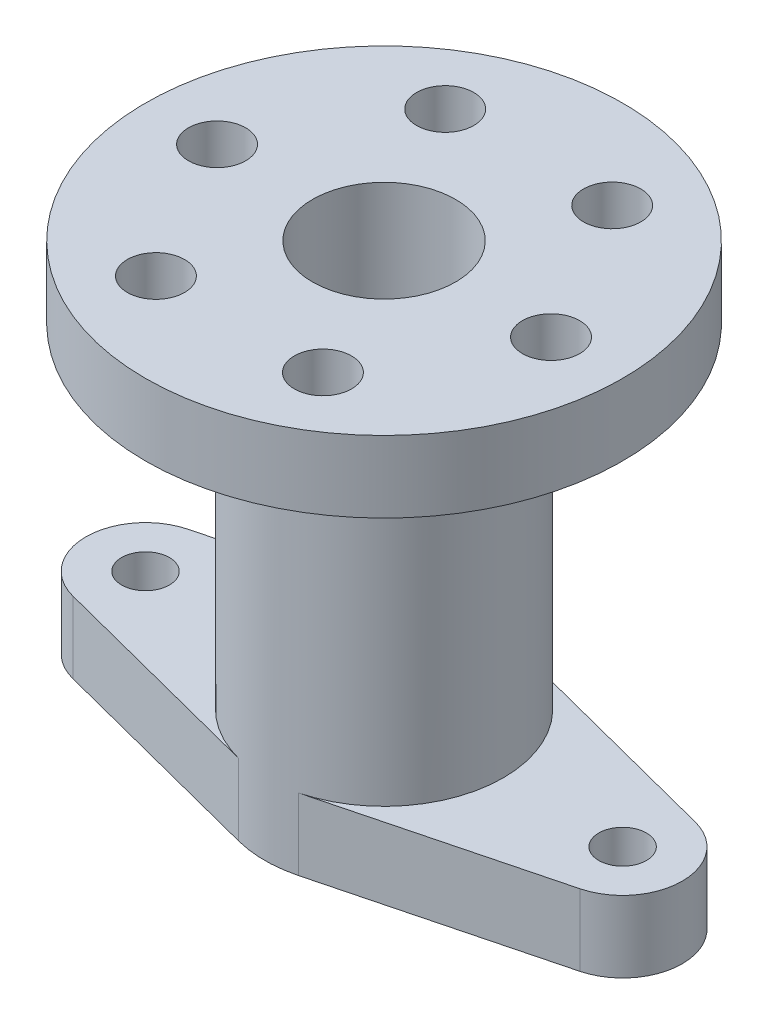
ISO-10303-21;
HEADER;
FILE_DESCRIPTION(('STEP AP214'),'2;1');
FILE_NAME('part.step','',(''),(''),'','','');
FILE_SCHEMA(('AUTOMOTIVE_DESIGN { 1 0 10303 214 1 1 1 1 }'));
ENDSEC;
DATA;
#1=APPLICATION_CONTEXT('core data for automotive mechanical design processes');
#2=APPLICATION_PROTOCOL_DEFINITION('international standard','automotive_design',2000,#1);
#3=PRODUCT_CONTEXT('',#1,'mechanical');
#4=PRODUCT('Part','Part','',(#3));
#5=PRODUCT_RELATED_PRODUCT_CATEGORY('part','',(#4));
#6=PRODUCT_DEFINITION_FORMATION('','',#4);
#7=PRODUCT_DEFINITION_CONTEXT('part definition',#1,'design');
#8=PRODUCT_DEFINITION('design','',#6,#7);
#9=PRODUCT_DEFINITION_SHAPE('','',#8);
#10=(LENGTH_UNIT() NAMED_UNIT(*) SI_UNIT(.MILLI.,.METRE.));
#11=(NAMED_UNIT(*) PLANE_ANGLE_UNIT() SI_UNIT($,.RADIAN.));
#12=(NAMED_UNIT(*) SI_UNIT($,.STERADIAN.) SOLID_ANGLE_UNIT());
#13=UNCERTAINTY_MEASURE_WITH_UNIT(LENGTH_MEASURE(1.E-05),#10,'distance_accuracy_value','');
#14=(GEOMETRIC_REPRESENTATION_CONTEXT(3) GLOBAL_UNCERTAINTY_ASSIGNED_CONTEXT((#13)) GLOBAL_UNIT_ASSIGNED_CONTEXT((#10,
#11,#12)) REPRESENTATION_CONTEXT('',''));
#15=CARTESIAN_POINT('',(0.,0.,0.));
#16=DIRECTION('',(0.,0.,1.));
#17=DIRECTION('',(1.,0.,0.));
#18=AXIS2_PLACEMENT_3D('',#15,#16,#17);
#19=CARTESIAN_POINT('',(-50.,0.,0.));
#20=DIRECTION('',(0.,1.,0.));
#21=DIRECTION('',(0.,0.,1.));
#22=AXIS2_PLACEMENT_3D('',#19,#20,#21);
#23=PLANE('',#22);
#24=CARTESIAN_POINT('',(0.,0.,0.));
#25=DIRECTION('',(0.,1.,0.));
#26=DIRECTION('',(0.,0.,1.));
#27=AXIS2_PLACEMENT_3D('',#24,#25,#26);
#28=CIRCLE('',#27,15.);
#29=CARTESIAN_POINT('',(0.,0.,15.));
#30=VERTEX_POINT('',#29);
#31=EDGE_CURVE('E452',#30,#30,#28,.T.);
#32=ORIENTED_EDGE('',*,*,#31,.T.);
#33=EDGE_LOOP('',(#32));
#34=FACE_BOUND('',#33,.T.);
#35=CARTESIAN_POINT('',(-50.,0.,0.));
#36=DIRECTION('',(0.,1.,0.));
#37=DIRECTION('',(0.,0.,1.));
#38=AXIS2_PLACEMENT_3D('',#35,#36,#37);
#39=CIRCLE('',#38,12.5);
#40=CARTESIAN_POINT('',(-53.125,0.,-12.1030729568982));
#41=VERTEX_POINT('',#40);
#42=CARTESIAN_POINT('',(-53.125,0.,12.1030729568982));
#43=VERTEX_POINT('',#42);
#44=EDGE_CURVE('E153',#41,#43,#39,.T.);
#45=ORIENTED_EDGE('',*,*,#44,.F.);
#46=DIRECTION('',(-0.968245836551854,0.,0.25));
#47=VECTOR('',#46,1.);
#48=CARTESIAN_POINT('',(-53.125,0.,-12.1030729568982));
#49=LINE('',#48,#47);
#50=CARTESIAN_POINT('',(-6.25,0.,-24.2061459137964));
#51=VERTEX_POINT('',#50);
#52=EDGE_CURVE('E101',#51,#41,#49,.T.);
#53=ORIENTED_EDGE('',*,*,#52,.F.);
#54=CARTESIAN_POINT('',(0.,0.,0.));
#55=DIRECTION('',(0.,1.,0.));
#56=DIRECTION('',(0.,0.,1.));
#57=AXIS2_PLACEMENT_3D('',#54,#55,#56);
#58=CIRCLE('',#57,25.);
#59=CARTESIAN_POINT('',(6.25,0.,-24.2061459137964));
#60=VERTEX_POINT('',#59);
#61=EDGE_CURVE('E95',#60,#51,#58,.T.);
#62=ORIENTED_EDGE('',*,*,#61,.F.);
#63=DIRECTION('',(-0.968245836551854,0.,-0.25));
#64=VECTOR('',#63,1.);
#65=CARTESIAN_POINT('',(53.125,0.,-12.1030729568982));
#66=LINE('',#65,#64);
#67=CARTESIAN_POINT('',(53.125,0.,-12.1030729568982));
#68=VERTEX_POINT('',#67);
#69=EDGE_CURVE('E137',#68,#60,#66,.T.);
#70=ORIENTED_EDGE('',*,*,#69,.F.);
#71=CARTESIAN_POINT('',(50.,0.,0.));
#72=DIRECTION('',(0.,1.,0.));
#73=DIRECTION('',(0.,0.,1.));
#74=AXIS2_PLACEMENT_3D('',#71,#72,#73);
#75=CIRCLE('',#74,12.5);
#76=CARTESIAN_POINT('',(53.125,0.,12.1030729568982));
#77=VERTEX_POINT('',#76);
#78=EDGE_CURVE('E185',#77,#68,#75,.T.);
#79=ORIENTED_EDGE('',*,*,#78,.F.);
#80=DIRECTION('',(0.968245836551854,0.,-0.25));
#81=VECTOR('',#80,1.);
#82=CARTESIAN_POINT('',(53.125,0.,12.1030729568982));
#83=LINE('',#82,#81);
#84=CARTESIAN_POINT('',(6.25,0.,24.2061459137964));
#85=VERTEX_POINT('',#84);
#86=EDGE_CURVE('E182',#85,#77,#83,.T.);
#87=ORIENTED_EDGE('',*,*,#86,.F.);
#88=CARTESIAN_POINT('',(0.,0.,0.));
#89=DIRECTION('',(0.,1.,0.));
#90=DIRECTION('',(0.,0.,1.));
#91=AXIS2_PLACEMENT_3D('',#88,#89,#90);
#92=CIRCLE('',#91,25.);
#93=CARTESIAN_POINT('',(-6.25000000000001,0.,24.2061459137964));
#94=VERTEX_POINT('',#93);
#95=EDGE_CURVE('E179',#94,#85,#92,.T.);
#96=ORIENTED_EDGE('',*,*,#95,.F.);
#97=DIRECTION('',(0.968245836551854,0.,0.25));
#98=VECTOR('',#97,1.);
#99=CARTESIAN_POINT('',(-53.125,0.,12.1030729568982));
#100=LINE('',#99,#98);
#101=EDGE_CURVE('E176',#43,#94,#100,.T.);
#102=ORIENTED_EDGE('',*,*,#101,.F.);
#103=EDGE_LOOP('',(#45,#53,#62,#70,#79,#87,#96,#102));
#104=FACE_BOUND('',#103,.T.);
#105=CARTESIAN_POINT('',(50.,0.,0.));
#106=DIRECTION('',(0.,-1.,0.));
#107=DIRECTION('',(0.,0.,-1.));
#108=AXIS2_PLACEMENT_3D('',#105,#106,#107);
#109=CIRCLE('',#108,5.00000000000001);
#110=CARTESIAN_POINT('',(50.,0.,-5.00000000000001));
#111=VERTEX_POINT('',#110);
#112=EDGE_CURVE('E388',#111,#111,#109,.T.);
#113=ORIENTED_EDGE('',*,*,#112,.F.);
#114=EDGE_LOOP('',(#113));
#115=FACE_BOUND('',#114,.T.);
#116=CARTESIAN_POINT('',(-50.,0.,0.));
#117=DIRECTION('',(0.,-1.,0.));
#118=DIRECTION('',(0.,0.,-1.));
#119=AXIS2_PLACEMENT_3D('',#116,#117,#118);
#120=CIRCLE('',#119,5.00000000000001);
#121=CARTESIAN_POINT('',(-50.,0.,-5.00000000000001));
#122=VERTEX_POINT('',#121);
#123=EDGE_CURVE('E382',#122,#122,#120,.T.);
#124=ORIENTED_EDGE('',*,*,#123,.F.);
#125=EDGE_LOOP('',(#124));
#126=FACE_BOUND('',#125,.T.);
#127=ADVANCED_FACE('F45',(#34,#104,#115,#126),#23,.F.);
#128=CARTESIAN_POINT('',(-50.,15.,0.));
#129=DIRECTION('',(0.,1.,0.));
#130=DIRECTION('',(0.,0.,1.));
#131=AXIS2_PLACEMENT_3D('',#128,#129,#130);
#132=PLANE('',#131);
#133=CARTESIAN_POINT('',(50.,15.,0.));
#134=DIRECTION('',(0.,1.,0.));
#135=DIRECTION('',(0.,0.,1.));
#136=AXIS2_PLACEMENT_3D('',#133,#134,#135);
#137=CIRCLE('',#136,5.00000000000001);
#138=CARTESIAN_POINT('',(50.,15.,5.00000000000001));
#139=VERTEX_POINT('',#138);
#140=EDGE_CURVE('E393',#139,#139,#137,.T.);
#141=ORIENTED_EDGE('',*,*,#140,.F.);
#142=EDGE_LOOP('',(#141));
#143=FACE_BOUND('',#142,.T.);
#144=CARTESIAN_POINT('',(0.,15.,0.));
#145=DIRECTION('',(0.,1.,0.));
#146=DIRECTION('',(0.,0.,1.));
#147=AXIS2_PLACEMENT_3D('',#144,#145,#146);
#148=CIRCLE('',#147,25.);
#149=CARTESIAN_POINT('',(6.25,15.,24.2061459137964));
#150=VERTEX_POINT('',#149);
#151=CARTESIAN_POINT('',(6.25,15.,-24.2061459137964));
#152=VERTEX_POINT('',#151);
#153=EDGE_CURVE('E57',#150,#152,#148,.T.);
#154=ORIENTED_EDGE('',*,*,#153,.F.);
#155=DIRECTION('',(0.968245836551854,0.,-0.25));
#156=VECTOR('',#155,1.);
#157=CARTESIAN_POINT('',(53.125,15.,12.1030729568982));
#158=LINE('',#157,#156);
#159=CARTESIAN_POINT('',(53.125,15.,12.1030729568982));
#160=VERTEX_POINT('',#159);
#161=EDGE_CURVE('E165',#150,#160,#158,.T.);
#162=ORIENTED_EDGE('',*,*,#161,.T.);
#163=CARTESIAN_POINT('',(50.,15.,0.));
#164=DIRECTION('',(0.,1.,0.));
#165=DIRECTION('',(0.,0.,1.));
#166=AXIS2_PLACEMENT_3D('',#163,#164,#165);
#167=CIRCLE('',#166,12.5);
#168=CARTESIAN_POINT('',(53.125,15.,-12.1030729568982));
#169=VERTEX_POINT('',#168);
#170=EDGE_CURVE('E128',#160,#169,#167,.T.);
#171=ORIENTED_EDGE('',*,*,#170,.T.);
#172=DIRECTION('',(-0.968245836551854,0.,-0.25));
#173=VECTOR('',#172,1.);
#174=CARTESIAN_POINT('',(53.125,15.,-12.1030729568982));
#175=LINE('',#174,#173);
#176=EDGE_CURVE('E123',#169,#152,#175,.T.);
#177=ORIENTED_EDGE('',*,*,#176,.T.);
#178=EDGE_LOOP('',(#154,#162,#171,#177));
#179=FACE_BOUND('',#178,.T.);
#180=ADVANCED_FACE('F125',(#143,#179),#132,.T.);
#181=CARTESIAN_POINT('',(-50.,15.,0.));
#182=DIRECTION('',(0.,-1.,0.));
#183=DIRECTION('',(0.,0.,-1.));
#184=AXIS2_PLACEMENT_3D('',#181,#182,#183);
#185=CYLINDRICAL_SURFACE('',#184,12.5);
#186=ORIENTED_EDGE('',*,*,#44,.T.);
#187=DIRECTION('',(0.,-1.,0.));
#188=VECTOR('',#187,1.);
#189=CARTESIAN_POINT('',(-53.125,15.,12.1030729568982));
#190=LINE('',#189,#188);
#191=CARTESIAN_POINT('',(-53.125,15.,12.1030729568982));
#192=VERTEX_POINT('',#191);
#193=EDGE_CURVE('E49',#192,#43,#190,.T.);
#194=ORIENTED_EDGE('',*,*,#193,.F.);
#195=CARTESIAN_POINT('',(-50.,15.,0.));
#196=DIRECTION('',(0.,1.,0.));
#197=DIRECTION('',(0.,0.,1.));
#198=AXIS2_PLACEMENT_3D('',#195,#196,#197);
#199=CIRCLE('',#198,12.5);
#200=CARTESIAN_POINT('',(-53.125,15.,-12.1030729568982));
#201=VERTEX_POINT('',#200);
#202=EDGE_CURVE('E160',#201,#192,#199,.T.);
#203=ORIENTED_EDGE('',*,*,#202,.F.);
#204=DIRECTION('',(0.,-1.,0.));
#205=VECTOR('',#204,1.);
#206=CARTESIAN_POINT('',(-53.125,15.,-12.1030729568982));
#207=LINE('',#206,#205);
#208=EDGE_CURVE('E172',#201,#41,#207,.T.);
#209=ORIENTED_EDGE('',*,*,#208,.T.);
#210=EDGE_LOOP('',(#186,#194,#203,#209));
#211=FACE_BOUND('',#210,.T.);
#212=ADVANCED_FACE('F47',(#211),#185,.T.);
#213=CARTESIAN_POINT('',(-53.125,15.,12.1030729568982));
#214=DIRECTION('',(0.25,0.,-0.968245836551854));
#215=DIRECTION('',(-0.968245836551854,0.,-0.25));
#216=AXIS2_PLACEMENT_3D('',#213,#214,#215);
#217=PLANE('',#216);
#218=ORIENTED_EDGE('',*,*,#101,.T.);
#219=DIRECTION('',(0.,-1.,0.));
#220=VECTOR('',#219,1.);
#221=CARTESIAN_POINT('',(-6.25000000000001,15.,24.2061459137964));
#222=LINE('',#221,#220);
#223=CARTESIAN_POINT('',(-6.25000000000001,15.,24.2061459137964));
#224=VERTEX_POINT('',#223);
#225=EDGE_CURVE('E205',#224,#94,#222,.T.);
#226=ORIENTED_EDGE('',*,*,#225,.F.);
#227=DIRECTION('',(0.968245836551854,0.,0.25));
#228=VECTOR('',#227,1.);
#229=CARTESIAN_POINT('',(-53.125,15.,12.1030729568982));
#230=LINE('',#229,#228);
#231=EDGE_CURVE('E110',#192,#224,#230,.T.);
#232=ORIENTED_EDGE('',*,*,#231,.F.);
#233=ORIENTED_EDGE('',*,*,#193,.T.);
#234=EDGE_LOOP('',(#218,#226,#232,#233));
#235=FACE_BOUND('',#234,.T.);
#236=ADVANCED_FACE('F211',(#235),#217,.F.);
#237=CARTESIAN_POINT('',(53.125,15.,12.1030729568982));
#238=DIRECTION('',(-0.25,0.,-0.968245836551854));
#239=DIRECTION('',(-0.968245836551854,0.,0.25));
#240=AXIS2_PLACEMENT_3D('',#237,#238,#239);
#241=PLANE('',#240);
#242=ORIENTED_EDGE('',*,*,#86,.T.);
#243=DIRECTION('',(0.,-1.,0.));
#244=VECTOR('',#243,1.);
#245=CARTESIAN_POINT('',(53.125,15.,12.1030729568982));
#246=LINE('',#245,#244);
#247=EDGE_CURVE('E200',#160,#77,#246,.T.);
#248=ORIENTED_EDGE('',*,*,#247,.F.);
#249=ORIENTED_EDGE('',*,*,#161,.F.);
#250=DIRECTION('',(0.,-1.,0.));
#251=VECTOR('',#250,1.);
#252=CARTESIAN_POINT('',(6.25,15.,24.2061459137964));
#253=LINE('',#252,#251);
#254=EDGE_CURVE('E146',#150,#85,#253,.T.);
#255=ORIENTED_EDGE('',*,*,#254,.T.);
#256=EDGE_LOOP('',(#242,#248,#249,#255));
#257=FACE_BOUND('',#256,.T.);
#258=ADVANCED_FACE('F221',(#257),#241,.F.);
#259=CARTESIAN_POINT('',(50.,15.,0.));
#260=DIRECTION('',(0.,-1.,0.));
#261=DIRECTION('',(0.,0.,-1.));
#262=AXIS2_PLACEMENT_3D('',#259,#260,#261);
#263=CYLINDRICAL_SURFACE('',#262,12.5);
#264=ORIENTED_EDGE('',*,*,#78,.T.);
#265=DIRECTION('',(0.,-1.,0.));
#266=VECTOR('',#265,1.);
#267=CARTESIAN_POINT('',(53.125,15.,-12.1030729568982));
#268=LINE('',#267,#266);
#269=EDGE_CURVE('E139',#169,#68,#268,.T.);
#270=ORIENTED_EDGE('',*,*,#269,.F.);
#271=ORIENTED_EDGE('',*,*,#170,.F.);
#272=ORIENTED_EDGE('',*,*,#247,.T.);
#273=EDGE_LOOP('',(#264,#270,#271,#272));
#274=FACE_BOUND('',#273,.T.);
#275=ADVANCED_FACE('F224',(#274),#263,.T.);
#276=CARTESIAN_POINT('',(53.125,15.,-12.1030729568982));
#277=DIRECTION('',(-0.25,0.,0.968245836551854));
#278=DIRECTION('',(0.968245836551854,0.,0.25));
#279=AXIS2_PLACEMENT_3D('',#276,#277,#278);
#280=PLANE('',#279);
#281=ORIENTED_EDGE('',*,*,#69,.T.);
#282=DIRECTION('',(0.,-1.,0.));
#283=VECTOR('',#282,1.);
#284=CARTESIAN_POINT('',(6.25,15.,-24.2061459137964));
#285=LINE('',#284,#283);
#286=EDGE_CURVE('E134',#152,#60,#285,.T.);
#287=ORIENTED_EDGE('',*,*,#286,.F.);
#288=ORIENTED_EDGE('',*,*,#176,.F.);
#289=ORIENTED_EDGE('',*,*,#269,.T.);
#290=EDGE_LOOP('',(#281,#287,#288,#289));
#291=FACE_BOUND('',#290,.T.);
#292=ADVANCED_FACE('F135',(#291),#280,.F.);
#293=CARTESIAN_POINT('',(0.,15.,0.));
#294=DIRECTION('',(0.,-1.,0.));
#295=DIRECTION('',(0.,0.,-1.));
#296=AXIS2_PLACEMENT_3D('',#293,#294,#295);
#297=CYLINDRICAL_SURFACE('',#296,25.);
#298=ORIENTED_EDGE('',*,*,#61,.T.);
#299=DIRECTION('',(0.,-1.,0.));
#300=VECTOR('',#299,1.);
#301=CARTESIAN_POINT('',(-6.25,15.,-24.2061459137964));
#302=LINE('',#301,#300);
#303=CARTESIAN_POINT('',(-6.25,15.,-24.2061459137964));
#304=VERTEX_POINT('',#303);
#305=EDGE_CURVE('E140',#304,#51,#302,.T.);
#306=ORIENTED_EDGE('',*,*,#305,.F.);
#307=EDGE_CURVE('E11',#304,#224,#148,.T.);
#308=ORIENTED_EDGE('',*,*,#307,.T.);
#309=ORIENTED_EDGE('',*,*,#225,.T.);
#310=ORIENTED_EDGE('',*,*,#95,.T.);
#311=ORIENTED_EDGE('',*,*,#254,.F.);
#312=ORIENTED_EDGE('',*,*,#153,.T.);
#313=ORIENTED_EDGE('',*,*,#286,.T.);
#314=EDGE_LOOP('',(#298,#306,#308,#309,#310,#311,#312,#313));
#315=FACE_BOUND('',#314,.T.);
#316=CARTESIAN_POINT('',(0.,85.,0.));
#317=DIRECTION('',(0.,1.,0.));
#318=DIRECTION('',(0.,0.,1.));
#319=AXIS2_PLACEMENT_3D('',#316,#317,#318);
#320=CIRCLE('',#319,25.);
#321=CARTESIAN_POINT('',(0.,85.,25.));
#322=VERTEX_POINT('',#321);
#323=EDGE_CURVE('E148',#322,#322,#320,.T.);
#324=ORIENTED_EDGE('',*,*,#323,.F.);
#325=EDGE_LOOP('',(#324));
#326=FACE_BOUND('',#325,.T.);
#327=ADVANCED_FACE('F143',(#315,#326),#297,.T.);
#328=CARTESIAN_POINT('',(-53.125,15.,-12.1030729568982));
#329=DIRECTION('',(0.25,0.,0.968245836551854));
#330=DIRECTION('',(0.968245836551854,0.,-0.25));
#331=AXIS2_PLACEMENT_3D('',#328,#329,#330);
#332=PLANE('',#331);
#333=ORIENTED_EDGE('',*,*,#52,.T.);
#334=ORIENTED_EDGE('',*,*,#208,.F.);
#335=DIRECTION('',(-0.968245836551854,0.,0.25));
#336=VECTOR('',#335,1.);
#337=CARTESIAN_POINT('',(-53.125,15.,-12.1030729568982));
#338=LINE('',#337,#336);
#339=EDGE_CURVE('E65',#304,#201,#338,.T.);
#340=ORIENTED_EDGE('',*,*,#339,.F.);
#341=ORIENTED_EDGE('',*,*,#305,.T.);
#342=EDGE_LOOP('',(#333,#334,#340,#341));
#343=FACE_BOUND('',#342,.T.);
#344=ADVANCED_FACE('F247',(#343),#332,.F.);
#345=CARTESIAN_POINT('',(-50.,15.,0.));
#346=DIRECTION('',(0.,1.,0.));
#347=DIRECTION('',(0.,0.,1.));
#348=AXIS2_PLACEMENT_3D('',#345,#346,#347);
#349=CIRCLE('',#348,5.00000000000001);
#350=CARTESIAN_POINT('',(-50.,15.,5.00000000000001));
#351=VERTEX_POINT('',#350);
#352=EDGE_CURVE('E385',#351,#351,#349,.T.);
#353=ORIENTED_EDGE('',*,*,#352,.F.);
#354=EDGE_LOOP('',(#353));
#355=FACE_BOUND('',#354,.T.);
#356=ORIENTED_EDGE('',*,*,#307,.F.);
#357=ORIENTED_EDGE('',*,*,#339,.T.);
#358=ORIENTED_EDGE('',*,*,#202,.T.);
#359=ORIENTED_EDGE('',*,*,#231,.T.);
#360=EDGE_LOOP('',(#356,#357,#358,#359));
#361=FACE_BOUND('',#360,.T.);
#362=ADVANCED_FACE('F243',(#355,#361),#132,.T.);
#363=CARTESIAN_POINT('',(0.,100.,0.));
#364=DIRECTION('',(0.,-1.,0.));
#365=DIRECTION('',(0.,0.,-1.));
#366=AXIS2_PLACEMENT_3D('',#363,#364,#365);
#367=CYLINDRICAL_SURFACE('',#366,50.);
#368=CARTESIAN_POINT('',(0.,100.,0.));
#369=DIRECTION('',(0.,1.,0.));
#370=DIRECTION('',(0.,0.,1.));
#371=AXIS2_PLACEMENT_3D('',#368,#369,#370);
#372=CIRCLE('',#371,50.);
#373=CARTESIAN_POINT('',(0.,100.,50.));
#374=VERTEX_POINT('',#373);
#375=EDGE_CURVE('E149',#374,#374,#372,.T.);
#376=ORIENTED_EDGE('',*,*,#375,.F.);
#377=EDGE_LOOP('',(#376));
#378=FACE_BOUND('',#377,.T.);
#379=CARTESIAN_POINT('',(0.,85.,0.));
#380=DIRECTION('',(0.,1.,0.));
#381=DIRECTION('',(0.,0.,1.));
#382=AXIS2_PLACEMENT_3D('',#379,#380,#381);
#383=CIRCLE('',#382,50.);
#384=CARTESIAN_POINT('',(0.,85.,50.));
#385=VERTEX_POINT('',#384);
#386=EDGE_CURVE('E156',#385,#385,#383,.T.);
#387=ORIENTED_EDGE('',*,*,#386,.T.);
#388=EDGE_LOOP('',(#387));
#389=FACE_BOUND('',#388,.T.);
#390=ADVANCED_FACE('F267',(#378,#389),#367,.T.);
#391=CARTESIAN_POINT('',(0.,100.,0.));
#392=DIRECTION('',(0.,1.,0.));
#393=DIRECTION('',(0.,0.,1.));
#394=AXIS2_PLACEMENT_3D('',#391,#392,#393);
#395=PLANE('',#394);
#396=CARTESIAN_POINT('',(17.5000000000004,100.,30.3108891324552));
#397=DIRECTION('',(0.,1.,0.));
#398=DIRECTION('',(0.,0.,1.));
#399=AXIS2_PLACEMENT_3D('',#396,#397,#398);
#400=CIRCLE('',#399,6.00000000000001);
#401=CARTESIAN_POINT('',(17.5000000000004,100.,36.3108891324552));
#402=VERTEX_POINT('',#401);
#403=EDGE_CURVE('E400',#402,#402,#400,.T.);
#404=ORIENTED_EDGE('',*,*,#403,.F.);
#405=EDGE_LOOP('',(#404));
#406=FACE_BOUND('',#405,.T.);
#407=CARTESIAN_POINT('',(-17.4999999999997,100.,30.3108891324555));
#408=DIRECTION('',(0.,1.,0.));
#409=DIRECTION('',(0.,0.,1.));
#410=AXIS2_PLACEMENT_3D('',#407,#408,#409);
#411=CIRCLE('',#410,6.00000000000001);
#412=CARTESIAN_POINT('',(-17.4999999999997,100.,36.3108891324555));
#413=VERTEX_POINT('',#412);
#414=EDGE_CURVE('E408',#413,#413,#411,.T.);
#415=ORIENTED_EDGE('',*,*,#414,.F.);
#416=EDGE_LOOP('',(#415));
#417=FACE_BOUND('',#416,.T.);
#418=CARTESIAN_POINT('',(-35.,100.,0.));
#419=DIRECTION('',(0.,1.,0.));
#420=DIRECTION('',(0.,0.,1.));
#421=AXIS2_PLACEMENT_3D('',#418,#419,#420);
#422=CIRCLE('',#421,6.00000000000001);
#423=CARTESIAN_POINT('',(-35.,100.,6.00000000000001));
#424=VERTEX_POINT('',#423);
#425=EDGE_CURVE('E416',#424,#424,#422,.T.);
#426=ORIENTED_EDGE('',*,*,#425,.F.);
#427=EDGE_LOOP('',(#426));
#428=FACE_BOUND('',#427,.T.);
#429=CARTESIAN_POINT('',(-17.5000000000001,100.,-30.3108891324553));
#430=DIRECTION('',(0.,1.,0.));
#431=DIRECTION('',(0.,0.,1.));
#432=AXIS2_PLACEMENT_3D('',#429,#430,#431);
#433=CIRCLE('',#432,6.00000000000001);
#434=CARTESIAN_POINT('',(-17.5000000000001,100.,-24.3108891324553));
#435=VERTEX_POINT('',#434);
#436=EDGE_CURVE('E424',#435,#435,#433,.T.);
#437=ORIENTED_EDGE('',*,*,#436,.F.);
#438=EDGE_LOOP('',(#437));
#439=FACE_BOUND('',#438,.T.);
#440=CARTESIAN_POINT('',(17.4999999999999,100.,-30.3108891324554));
#441=DIRECTION('',(0.,1.,0.));
#442=DIRECTION('',(0.,0.,1.));
#443=AXIS2_PLACEMENT_3D('',#440,#441,#442);
#444=CIRCLE('',#443,6.00000000000001);
#445=CARTESIAN_POINT('',(17.4999999999999,100.,-24.3108891324554));
#446=VERTEX_POINT('',#445);
#447=EDGE_CURVE('E432',#446,#446,#444,.T.);
#448=ORIENTED_EDGE('',*,*,#447,.F.);
#449=EDGE_LOOP('',(#448));
#450=FACE_BOUND('',#449,.T.);
#451=CARTESIAN_POINT('',(35.,100.,0.));
#452=DIRECTION('',(0.,1.,0.));
#453=DIRECTION('',(0.,0.,1.));
#454=AXIS2_PLACEMENT_3D('',#451,#452,#453);
#455=CIRCLE('',#454,6.00000000000001);
#456=CARTESIAN_POINT('',(35.,100.,6.00000000000001));
#457=VERTEX_POINT('',#456);
#458=EDGE_CURVE('E440',#457,#457,#455,.T.);
#459=ORIENTED_EDGE('',*,*,#458,.F.);
#460=EDGE_LOOP('',(#459));
#461=FACE_BOUND('',#460,.T.);
#462=CARTESIAN_POINT('',(0.,100.,0.));
#463=DIRECTION('',(0.,1.,0.));
#464=DIRECTION('',(0.,0.,1.));
#465=AXIS2_PLACEMENT_3D('',#462,#463,#464);
#466=CIRCLE('',#465,15.);
#467=CARTESIAN_POINT('',(0.,100.,15.));
#468=VERTEX_POINT('',#467);
#469=EDGE_CURVE('E448',#468,#468,#466,.T.);
#470=ORIENTED_EDGE('',*,*,#469,.F.);
#471=EDGE_LOOP('',(#470));
#472=FACE_BOUND('',#471,.T.);
#473=ORIENTED_EDGE('',*,*,#375,.T.);
#474=EDGE_LOOP('',(#473));
#475=FACE_BOUND('',#474,.T.);
#476=ADVANCED_FACE('F270',(#406,#417,#428,#439,#450,#461,#472,#475),#395,.T.);
#477=CARTESIAN_POINT('',(0.,85.,0.));
#478=DIRECTION('',(0.,1.,0.));
#479=DIRECTION('',(0.,0.,1.));
#480=AXIS2_PLACEMENT_3D('',#477,#478,#479);
#481=PLANE('',#480);
#482=CARTESIAN_POINT('',(17.5000000000004,85.,30.3108891324552));
#483=DIRECTION('',(0.,1.,0.));
#484=DIRECTION('',(0.,0.,1.));
#485=AXIS2_PLACEMENT_3D('',#482,#483,#484);
#486=CIRCLE('',#485,6.00000000000001);
#487=CARTESIAN_POINT('',(17.5000000000004,85.,36.3108891324552));
#488=VERTEX_POINT('',#487);
#489=EDGE_CURVE('E404',#488,#488,#486,.T.);
#490=ORIENTED_EDGE('',*,*,#489,.T.);
#491=EDGE_LOOP('',(#490));
#492=FACE_BOUND('',#491,.T.);
#493=CARTESIAN_POINT('',(-17.4999999999997,85.,30.3108891324555));
#494=DIRECTION('',(0.,1.,0.));
#495=DIRECTION('',(0.,0.,1.));
#496=AXIS2_PLACEMENT_3D('',#493,#494,#495);
#497=CIRCLE('',#496,6.00000000000001);
#498=CARTESIAN_POINT('',(-17.4999999999997,85.,36.3108891324555));
#499=VERTEX_POINT('',#498);
#500=EDGE_CURVE('E412',#499,#499,#497,.T.);
#501=ORIENTED_EDGE('',*,*,#500,.T.);
#502=EDGE_LOOP('',(#501));
#503=FACE_BOUND('',#502,.T.);
#504=CARTESIAN_POINT('',(-35.,85.,0.));
#505=DIRECTION('',(0.,1.,0.));
#506=DIRECTION('',(0.,0.,1.));
#507=AXIS2_PLACEMENT_3D('',#504,#505,#506);
#508=CIRCLE('',#507,6.00000000000001);
#509=CARTESIAN_POINT('',(-35.,85.,6.00000000000001));
#510=VERTEX_POINT('',#509);
#511=EDGE_CURVE('E420',#510,#510,#508,.T.);
#512=ORIENTED_EDGE('',*,*,#511,.T.);
#513=EDGE_LOOP('',(#512));
#514=FACE_BOUND('',#513,.T.);
#515=CARTESIAN_POINT('',(-17.5000000000001,85.,-30.3108891324553));
#516=DIRECTION('',(0.,1.,0.));
#517=DIRECTION('',(0.,0.,1.));
#518=AXIS2_PLACEMENT_3D('',#515,#516,#517);
#519=CIRCLE('',#518,6.00000000000001);
#520=CARTESIAN_POINT('',(-17.5000000000001,85.,-24.3108891324553));
#521=VERTEX_POINT('',#520);
#522=EDGE_CURVE('E428',#521,#521,#519,.T.);
#523=ORIENTED_EDGE('',*,*,#522,.T.);
#524=EDGE_LOOP('',(#523));
#525=FACE_BOUND('',#524,.T.);
#526=CARTESIAN_POINT('',(17.4999999999999,85.,-30.3108891324554));
#527=DIRECTION('',(0.,1.,0.));
#528=DIRECTION('',(0.,0.,1.));
#529=AXIS2_PLACEMENT_3D('',#526,#527,#528);
#530=CIRCLE('',#529,6.00000000000001);
#531=CARTESIAN_POINT('',(17.4999999999999,85.,-24.3108891324554));
#532=VERTEX_POINT('',#531);
#533=EDGE_CURVE('E436',#532,#532,#530,.T.);
#534=ORIENTED_EDGE('',*,*,#533,.T.);
#535=EDGE_LOOP('',(#534));
#536=FACE_BOUND('',#535,.T.);
#537=CARTESIAN_POINT('',(35.,85.,0.));
#538=DIRECTION('',(0.,1.,0.));
#539=DIRECTION('',(0.,0.,1.));
#540=AXIS2_PLACEMENT_3D('',#537,#538,#539);
#541=CIRCLE('',#540,6.00000000000001);
#542=CARTESIAN_POINT('',(35.,85.,6.00000000000001));
#543=VERTEX_POINT('',#542);
#544=EDGE_CURVE('E444',#543,#543,#541,.T.);
#545=ORIENTED_EDGE('',*,*,#544,.T.);
#546=EDGE_LOOP('',(#545));
#547=FACE_BOUND('',#546,.T.);
#548=ORIENTED_EDGE('',*,*,#323,.T.);
#549=EDGE_LOOP('',(#548));
#550=FACE_BOUND('',#549,.T.);
#551=ORIENTED_EDGE('',*,*,#386,.F.);
#552=EDGE_LOOP('',(#551));
#553=FACE_BOUND('',#552,.T.);
#554=ADVANCED_FACE('F281',(#492,#503,#514,#525,#536,#547,#550,#553),#481,.F.);
#555=CARTESIAN_POINT('',(0.,100.,0.));
#556=DIRECTION('',(0.,1.,0.));
#557=DIRECTION('',(0.,0.,1.));
#558=AXIS2_PLACEMENT_3D('',#555,#556,#557);
#559=CYLINDRICAL_SURFACE('',#558,15.);
#560=ORIENTED_EDGE('',*,*,#31,.F.);
#561=EDGE_LOOP('',(#560));
#562=FACE_BOUND('',#561,.T.);
#563=ORIENTED_EDGE('',*,*,#469,.T.);
#564=EDGE_LOOP('',(#563));
#565=FACE_BOUND('',#564,.T.);
#566=ADVANCED_FACE('F276',(#562,#565),#559,.F.);
#567=CARTESIAN_POINT('',(35.,100.,0.));
#568=DIRECTION('',(0.,1.,0.));
#569=DIRECTION('',(0.,0.,1.));
#570=AXIS2_PLACEMENT_3D('',#567,#568,#569);
#571=CYLINDRICAL_SURFACE('',#570,6.00000000000001);
#572=ORIENTED_EDGE('',*,*,#544,.F.);
#573=EDGE_LOOP('',(#572));
#574=FACE_BOUND('',#573,.T.);
#575=ORIENTED_EDGE('',*,*,#458,.T.);
#576=EDGE_LOOP('',(#575));
#577=FACE_BOUND('',#576,.T.);
#578=ADVANCED_FACE('F280',(#574,#577),#571,.F.);
#579=CARTESIAN_POINT('',(17.4999999999999,100.,-30.3108891324554));
#580=DIRECTION('',(0.,1.,0.));
#581=DIRECTION('',(0.,0.,1.));
#582=AXIS2_PLACEMENT_3D('',#579,#580,#581);
#583=CYLINDRICAL_SURFACE('',#582,6.00000000000001);
#584=ORIENTED_EDGE('',*,*,#533,.F.);
#585=EDGE_LOOP('',(#584));
#586=FACE_BOUND('',#585,.T.);
#587=ORIENTED_EDGE('',*,*,#447,.T.);
#588=EDGE_LOOP('',(#587));
#589=FACE_BOUND('',#588,.T.);
#590=ADVANCED_FACE('F291',(#586,#589),#583,.F.);
#591=CARTESIAN_POINT('',(-17.5000000000001,100.,-30.3108891324553));
#592=DIRECTION('',(0.,1.,0.));
#593=DIRECTION('',(0.,0.,1.));
#594=AXIS2_PLACEMENT_3D('',#591,#592,#593);
#595=CYLINDRICAL_SURFACE('',#594,6.00000000000001);
#596=ORIENTED_EDGE('',*,*,#522,.F.);
#597=EDGE_LOOP('',(#596));
#598=FACE_BOUND('',#597,.T.);
#599=ORIENTED_EDGE('',*,*,#436,.T.);
#600=EDGE_LOOP('',(#599));
#601=FACE_BOUND('',#600,.T.);
#602=ADVANCED_FACE('F314',(#598,#601),#595,.F.);
#603=CARTESIAN_POINT('',(-35.,100.,0.));
#604=DIRECTION('',(0.,1.,0.));
#605=DIRECTION('',(0.,0.,1.));
#606=AXIS2_PLACEMENT_3D('',#603,#604,#605);
#607=CYLINDRICAL_SURFACE('',#606,6.00000000000001);
#608=ORIENTED_EDGE('',*,*,#511,.F.);
#609=EDGE_LOOP('',(#608));
#610=FACE_BOUND('',#609,.T.);
#611=ORIENTED_EDGE('',*,*,#425,.T.);
#612=EDGE_LOOP('',(#611));
#613=FACE_BOUND('',#612,.T.);
#614=ADVANCED_FACE('F323',(#610,#613),#607,.F.);
#615=CARTESIAN_POINT('',(-17.4999999999997,100.,30.3108891324555));
#616=DIRECTION('',(0.,1.,0.));
#617=DIRECTION('',(0.,0.,1.));
#618=AXIS2_PLACEMENT_3D('',#615,#616,#617);
#619=CYLINDRICAL_SURFACE('',#618,6.00000000000001);
#620=ORIENTED_EDGE('',*,*,#500,.F.);
#621=EDGE_LOOP('',(#620));
#622=FACE_BOUND('',#621,.T.);
#623=ORIENTED_EDGE('',*,*,#414,.T.);
#624=EDGE_LOOP('',(#623));
#625=FACE_BOUND('',#624,.T.);
#626=ADVANCED_FACE('F332',(#622,#625),#619,.F.);
#627=CARTESIAN_POINT('',(17.5000000000004,100.,30.3108891324552));
#628=DIRECTION('',(0.,1.,0.));
#629=DIRECTION('',(0.,0.,1.));
#630=AXIS2_PLACEMENT_3D('',#627,#628,#629);
#631=CYLINDRICAL_SURFACE('',#630,6.00000000000001);
#632=ORIENTED_EDGE('',*,*,#489,.F.);
#633=EDGE_LOOP('',(#632));
#634=FACE_BOUND('',#633,.T.);
#635=ORIENTED_EDGE('',*,*,#403,.T.);
#636=EDGE_LOOP('',(#635));
#637=FACE_BOUND('',#636,.T.);
#638=ADVANCED_FACE('F340',(#634,#637),#631,.F.);
#639=CARTESIAN_POINT('',(50.,0.,0.));
#640=DIRECTION('',(0.,-1.,0.));
#641=DIRECTION('',(0.,0.,-1.));
#642=AXIS2_PLACEMENT_3D('',#639,#640,#641);
#643=CYLINDRICAL_SURFACE('',#642,5.00000000000001);
#644=ORIENTED_EDGE('',*,*,#112,.T.);
#645=EDGE_LOOP('',(#644));
#646=FACE_BOUND('',#645,.T.);
#647=ORIENTED_EDGE('',*,*,#140,.T.);
#648=EDGE_LOOP('',(#647));
#649=FACE_BOUND('',#648,.T.);
#650=ADVANCED_FACE('F348',(#646,#649),#643,.F.);
#651=CARTESIAN_POINT('',(-50.,0.,0.));
#652=DIRECTION('',(0.,-1.,0.));
#653=DIRECTION('',(0.,0.,-1.));
#654=AXIS2_PLACEMENT_3D('',#651,#652,#653);
#655=CYLINDRICAL_SURFACE('',#654,5.00000000000001);
#656=ORIENTED_EDGE('',*,*,#123,.T.);
#657=EDGE_LOOP('',(#656));
#658=FACE_BOUND('',#657,.T.);
#659=ORIENTED_EDGE('',*,*,#352,.T.);
#660=EDGE_LOOP('',(#659));
#661=FACE_BOUND('',#660,.T.);
#662=ADVANCED_FACE('F365',(#658,#661),#655,.F.);
#663=CLOSED_SHELL('',(#127,#180,#212,#236,#258,#275,#292,#327,#344,#362,#390,#476,#554,#566,
#578,#590,#602,#614,#626,#638,#650,#662));
#664=MANIFOLD_SOLID_BREP('B2',#663);
#665=ADVANCED_BREP_SHAPE_REPRESENTATION('',(#18,#664),#14);
#666=SHAPE_DEFINITION_REPRESENTATION(#9,#665);
ENDSEC;
END-ISO-10303-21;
